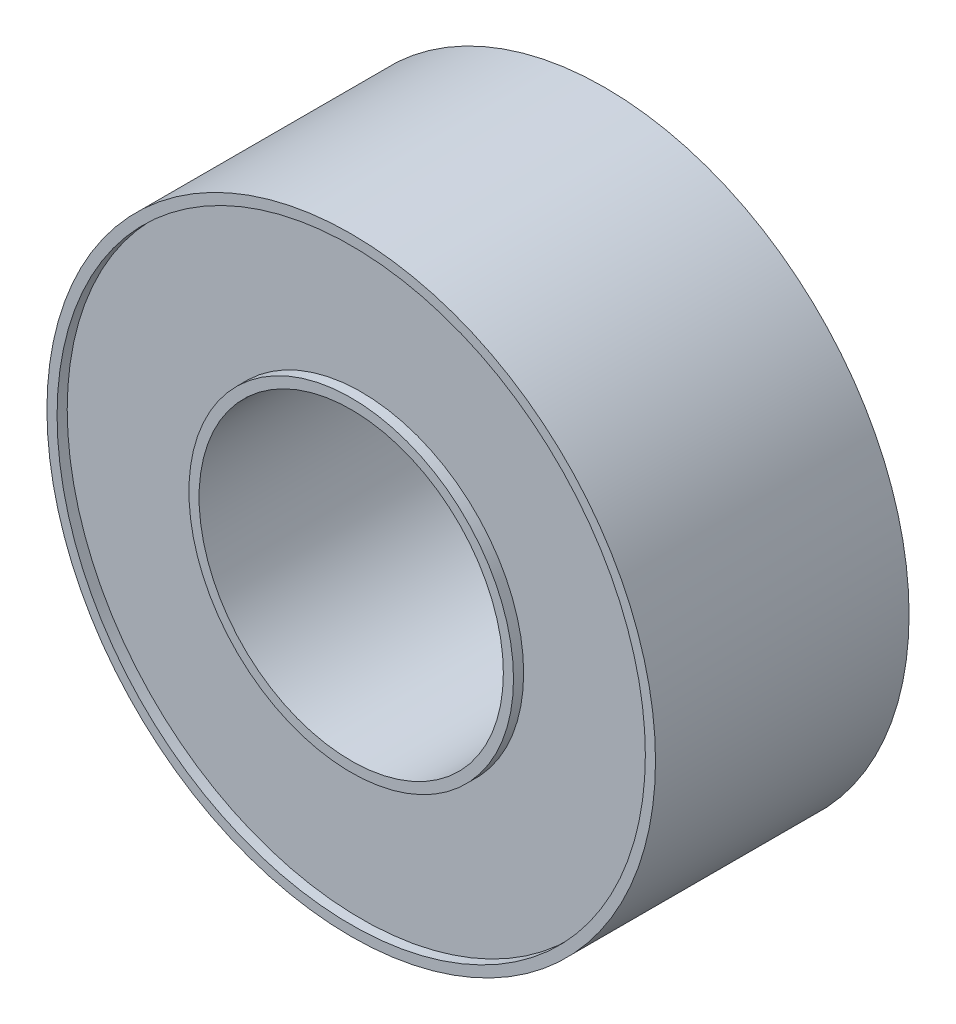
ISO-10303-21;
HEADER;
FILE_DESCRIPTION(('STEP AP214'),'2;1');
FILE_NAME('part.step','',(''),(''),'','','');
FILE_SCHEMA(('AUTOMOTIVE_DESIGN { 1 0 10303 214 1 1 1 1 }'));
ENDSEC;
DATA;
#1=APPLICATION_CONTEXT('core data for automotive mechanical design processes');
#2=APPLICATION_PROTOCOL_DEFINITION('international standard','automotive_design',2000,#1);
#3=PRODUCT_CONTEXT('',#1,'mechanical');
#4=PRODUCT('Part','Part','',(#3));
#5=PRODUCT_RELATED_PRODUCT_CATEGORY('part','',(#4));
#6=PRODUCT_DEFINITION_FORMATION('','',#4);
#7=PRODUCT_DEFINITION_CONTEXT('part definition',#1,'design');
#8=PRODUCT_DEFINITION('design','',#6,#7);
#9=PRODUCT_DEFINITION_SHAPE('','',#8);
#10=(LENGTH_UNIT() NAMED_UNIT(*) SI_UNIT(.MILLI.,.METRE.));
#11=(NAMED_UNIT(*) PLANE_ANGLE_UNIT() SI_UNIT($,.RADIAN.));
#12=(NAMED_UNIT(*) SI_UNIT($,.STERADIAN.) SOLID_ANGLE_UNIT());
#13=UNCERTAINTY_MEASURE_WITH_UNIT(LENGTH_MEASURE(1.E-05),#10,'distance_accuracy_value','');
#14=(GEOMETRIC_REPRESENTATION_CONTEXT(3) GLOBAL_UNCERTAINTY_ASSIGNED_CONTEXT((#13)) GLOBAL_UNIT_ASSIGNED_CONTEXT((#10,
#11,#12)) REPRESENTATION_CONTEXT('',''));
#15=CARTESIAN_POINT('',(0.,0.,0.));
#16=DIRECTION('',(0.,0.,1.));
#17=DIRECTION('',(1.,0.,0.));
#18=AXIS2_PLACEMENT_3D('',#15,#16,#17);
#19=CARTESIAN_POINT('',(0.,0.,0.));
#20=DIRECTION('',(0.,0.,1.));
#21=DIRECTION('',(1.,0.,0.));
#22=AXIS2_PLACEMENT_3D('',#19,#20,#21);
#23=PLANE('',#22);
#24=CARTESIAN_POINT('',(0.,0.,0.));
#25=DIRECTION('',(0.,0.,1.));
#26=DIRECTION('',(1.,0.,0.));
#27=AXIS2_PLACEMENT_3D('',#24,#25,#26);
#28=CIRCLE('',#27,1.5);
#29=CARTESIAN_POINT('',(1.5,0.,0.));
#30=VERTEX_POINT('',#29);
#31=EDGE_CURVE('E54',#30,#30,#28,.T.);
#32=ORIENTED_EDGE('',*,*,#31,.T.);
#33=EDGE_LOOP('',(#32));
#34=FACE_BOUND('',#33,.T.);
#35=CARTESIAN_POINT('',(0.,0.,0.));
#36=DIRECTION('',(0.,0.,-1.));
#37=DIRECTION('',(-1.,0.,0.));
#38=AXIS2_PLACEMENT_3D('',#35,#36,#37);
#39=CIRCLE('',#38,1.6);
#40=CARTESIAN_POINT('',(-1.6,0.,0.));
#41=VERTEX_POINT('',#40);
#42=EDGE_CURVE('E95',#41,#41,#39,.T.);
#43=ORIENTED_EDGE('',*,*,#42,.T.);
#44=EDGE_LOOP('',(#43));
#45=FACE_BOUND('',#44,.T.);
#46=ADVANCED_FACE('F50',(#34,#45),#23,.F.);
#47=CARTESIAN_POINT('',(0.,0.,2.5));
#48=DIRECTION('',(0.,0.,-1.));
#49=DIRECTION('',(-1.,0.,0.));
#50=AXIS2_PLACEMENT_3D('',#47,#48,#49);
#51=CYLINDRICAL_SURFACE('',#50,1.5);
#52=CARTESIAN_POINT('',(0.,0.,2.5));
#53=DIRECTION('',(0.,0.,1.));
#54=DIRECTION('',(1.,0.,0.));
#55=AXIS2_PLACEMENT_3D('',#52,#53,#54);
#56=CIRCLE('',#55,1.5);
#57=CARTESIAN_POINT('',(1.5,0.,2.5));
#58=VERTEX_POINT('',#57);
#59=EDGE_CURVE('E59',#58,#58,#56,.T.);
#60=ORIENTED_EDGE('',*,*,#59,.T.);
#61=EDGE_LOOP('',(#60));
#62=FACE_BOUND('',#61,.T.);
#63=ORIENTED_EDGE('',*,*,#31,.F.);
#64=EDGE_LOOP('',(#63));
#65=FACE_BOUND('',#64,.T.);
#66=ADVANCED_FACE('F52',(#62,#65),#51,.F.);
#67=CARTESIAN_POINT('',(0.,0.,2.5));
#68=DIRECTION('',(0.,0.,-1.));
#69=DIRECTION('',(-1.,0.,0.));
#70=AXIS2_PLACEMENT_3D('',#67,#68,#69);
#71=CYLINDRICAL_SURFACE('',#70,1.6);
#72=CARTESIAN_POINT('',(0.,0.,2.4));
#73=DIRECTION('',(0.,0.,1.));
#74=DIRECTION('',(1.,0.,0.));
#75=AXIS2_PLACEMENT_3D('',#72,#73,#74);
#76=CIRCLE('',#75,1.6);
#77=CARTESIAN_POINT('',(1.6,0.,2.4));
#78=VERTEX_POINT('',#77);
#79=EDGE_CURVE('E66',#78,#78,#76,.T.);
#80=ORIENTED_EDGE('',*,*,#79,.T.);
#81=EDGE_LOOP('',(#80));
#82=FACE_BOUND('',#81,.T.);
#83=CARTESIAN_POINT('',(0.,0.,2.5));
#84=DIRECTION('',(0.,0.,1.));
#85=DIRECTION('',(1.,0.,0.));
#86=AXIS2_PLACEMENT_3D('',#83,#84,#85);
#87=CIRCLE('',#86,1.6);
#88=CARTESIAN_POINT('',(1.6,0.,2.5));
#89=VERTEX_POINT('',#88);
#90=EDGE_CURVE('E11',#89,#89,#87,.T.);
#91=ORIENTED_EDGE('',*,*,#90,.F.);
#92=EDGE_LOOP('',(#91));
#93=FACE_BOUND('',#92,.T.);
#94=ADVANCED_FACE('F146',(#82,#93),#71,.T.);
#95=CARTESIAN_POINT('',(0.,0.,2.5));
#96=DIRECTION('',(0.,0.,1.));
#97=DIRECTION('',(1.,0.,0.));
#98=AXIS2_PLACEMENT_3D('',#95,#96,#97);
#99=PLANE('',#98);
#100=ORIENTED_EDGE('',*,*,#59,.F.);
#101=EDGE_LOOP('',(#100));
#102=FACE_BOUND('',#101,.T.);
#103=ORIENTED_EDGE('',*,*,#90,.T.);
#104=EDGE_LOOP('',(#103));
#105=FACE_BOUND('',#104,.T.);
#106=ADVANCED_FACE('F123',(#102,#105),#99,.T.);
#107=CARTESIAN_POINT('',(0.,0.,0.));
#108=DIRECTION('',(0.,0.,-1.));
#109=DIRECTION('',(-1.,0.,0.));
#110=AXIS2_PLACEMENT_3D('',#107,#108,#109);
#111=CIRCLE('',#110,2.9);
#112=CARTESIAN_POINT('',(-2.9,0.,0.));
#113=VERTEX_POINT('',#112);
#114=EDGE_CURVE('E87',#113,#113,#111,.T.);
#115=ORIENTED_EDGE('',*,*,#114,.F.);
#116=EDGE_LOOP('',(#115));
#117=FACE_BOUND('',#116,.T.);
#118=CARTESIAN_POINT('',(0.,0.,0.));
#119=DIRECTION('',(0.,0.,1.));
#120=DIRECTION('',(1.,0.,0.));
#121=AXIS2_PLACEMENT_3D('',#118,#119,#120);
#122=CIRCLE('',#121,3.);
#123=CARTESIAN_POINT('',(3.,0.,0.));
#124=VERTEX_POINT('',#123);
#125=EDGE_CURVE('E75',#124,#124,#122,.T.);
#126=ORIENTED_EDGE('',*,*,#125,.F.);
#127=EDGE_LOOP('',(#126));
#128=FACE_BOUND('',#127,.T.);
#129=ADVANCED_FACE('F119',(#117,#128),#23,.F.);
#130=CARTESIAN_POINT('',(0.,0.,2.4));
#131=DIRECTION('',(0.,0.,1.));
#132=DIRECTION('',(1.,0.,0.));
#133=AXIS2_PLACEMENT_3D('',#130,#131,#132);
#134=PLANE('',#133);
#135=CARTESIAN_POINT('',(0.,0.,2.4));
#136=DIRECTION('',(0.,0.,1.));
#137=DIRECTION('',(1.,0.,0.));
#138=AXIS2_PLACEMENT_3D('',#135,#136,#137);
#139=CIRCLE('',#138,2.9);
#140=CARTESIAN_POINT('',(2.9,0.,2.4));
#141=VERTEX_POINT('',#140);
#142=EDGE_CURVE('E70',#141,#141,#139,.F.);
#143=ORIENTED_EDGE('',*,*,#142,.F.);
#144=EDGE_LOOP('',(#143));
#145=FACE_BOUND('',#144,.T.);
#146=ORIENTED_EDGE('',*,*,#79,.F.);
#147=EDGE_LOOP('',(#146));
#148=FACE_BOUND('',#147,.T.);
#149=ADVANCED_FACE('F122',(#145,#148),#134,.T.);
#150=CARTESIAN_POINT('',(0.,0.,2.5));
#151=DIRECTION('',(0.,0.,-1.));
#152=DIRECTION('',(-1.,0.,0.));
#153=AXIS2_PLACEMENT_3D('',#150,#151,#152);
#154=CYLINDRICAL_SURFACE('',#153,2.9);
#155=ORIENTED_EDGE('',*,*,#142,.T.);
#156=EDGE_LOOP('',(#155));
#157=FACE_BOUND('',#156,.T.);
#158=CARTESIAN_POINT('',(0.,0.,2.5));
#159=DIRECTION('',(0.,0.,1.));
#160=DIRECTION('',(1.,0.,0.));
#161=AXIS2_PLACEMENT_3D('',#158,#159,#160);
#162=CIRCLE('',#161,2.9);
#163=CARTESIAN_POINT('',(2.9,0.,2.5));
#164=VERTEX_POINT('',#163);
#165=EDGE_CURVE('E79',#164,#164,#162,.T.);
#166=ORIENTED_EDGE('',*,*,#165,.T.);
#167=EDGE_LOOP('',(#166));
#168=FACE_BOUND('',#167,.T.);
#169=ADVANCED_FACE('F129',(#157,#168),#154,.F.);
#170=CARTESIAN_POINT('',(0.,0.,2.5));
#171=DIRECTION('',(0.,0.,-1.));
#172=DIRECTION('',(-1.,0.,0.));
#173=AXIS2_PLACEMENT_3D('',#170,#171,#172);
#174=CYLINDRICAL_SURFACE('',#173,3.);
#175=CARTESIAN_POINT('',(0.,0.,2.5));
#176=DIRECTION('',(0.,0.,1.));
#177=DIRECTION('',(1.,0.,0.));
#178=AXIS2_PLACEMENT_3D('',#175,#176,#177);
#179=CIRCLE('',#178,3.);
#180=CARTESIAN_POINT('',(3.,0.,2.5));
#181=VERTEX_POINT('',#180);
#182=EDGE_CURVE('E74',#181,#181,#179,.T.);
#183=ORIENTED_EDGE('',*,*,#182,.F.);
#184=EDGE_LOOP('',(#183));
#185=FACE_BOUND('',#184,.T.);
#186=ORIENTED_EDGE('',*,*,#125,.T.);
#187=EDGE_LOOP('',(#186));
#188=FACE_BOUND('',#187,.T.);
#189=ADVANCED_FACE('F127',(#185,#188),#174,.T.);
#190=CARTESIAN_POINT('',(0.,0.,2.5));
#191=DIRECTION('',(0.,0.,1.));
#192=DIRECTION('',(1.,0.,0.));
#193=AXIS2_PLACEMENT_3D('',#190,#191,#192);
#194=PLANE('',#193);
#195=ORIENTED_EDGE('',*,*,#165,.F.);
#196=EDGE_LOOP('',(#195));
#197=FACE_BOUND('',#196,.T.);
#198=ORIENTED_EDGE('',*,*,#182,.T.);
#199=EDGE_LOOP('',(#198));
#200=FACE_BOUND('',#199,.T.);
#201=ADVANCED_FACE('F115',(#197,#200),#194,.T.);
#202=CARTESIAN_POINT('',(0.,0.,0.1));
#203=DIRECTION('',(0.,0.,-1.));
#204=DIRECTION('',(-1.,0.,0.));
#205=AXIS2_PLACEMENT_3D('',#202,#203,#204);
#206=CYLINDRICAL_SURFACE('',#205,2.9);
#207=CARTESIAN_POINT('',(0.,0.,0.1));
#208=DIRECTION('',(0.,0.,-1.));
#209=DIRECTION('',(-1.,0.,0.));
#210=AXIS2_PLACEMENT_3D('',#207,#208,#209);
#211=CIRCLE('',#210,2.9);
#212=CARTESIAN_POINT('',(-2.9,0.,0.1));
#213=VERTEX_POINT('',#212);
#214=EDGE_CURVE('E80',#213,#213,#211,.T.);
#215=ORIENTED_EDGE('',*,*,#214,.F.);
#216=EDGE_LOOP('',(#215));
#217=FACE_BOUND('',#216,.T.);
#218=ORIENTED_EDGE('',*,*,#114,.T.);
#219=EDGE_LOOP('',(#218));
#220=FACE_BOUND('',#219,.T.);
#221=ADVANCED_FACE('F109',(#217,#220),#206,.F.);
#222=CARTESIAN_POINT('',(0.,0.,0.1));
#223=DIRECTION('',(0.,0.,-1.));
#224=DIRECTION('',(-1.,0.,0.));
#225=AXIS2_PLACEMENT_3D('',#222,#223,#224);
#226=PLANE('',#225);
#227=CARTESIAN_POINT('',(0.,0.,0.1));
#228=DIRECTION('',(0.,0.,-1.));
#229=DIRECTION('',(-1.,0.,0.));
#230=AXIS2_PLACEMENT_3D('',#227,#228,#229);
#231=CIRCLE('',#230,1.6);
#232=CARTESIAN_POINT('',(-1.6,0.,0.1));
#233=VERTEX_POINT('',#232);
#234=EDGE_CURVE('E91',#233,#233,#231,.T.);
#235=ORIENTED_EDGE('',*,*,#234,.F.);
#236=EDGE_LOOP('',(#235));
#237=FACE_BOUND('',#236,.T.);
#238=ORIENTED_EDGE('',*,*,#214,.T.);
#239=EDGE_LOOP('',(#238));
#240=FACE_BOUND('',#239,.T.);
#241=ADVANCED_FACE('F106',(#237,#240),#226,.T.);
#242=CARTESIAN_POINT('',(0.,0.,0.1));
#243=DIRECTION('',(0.,0.,-1.));
#244=DIRECTION('',(-1.,0.,0.));
#245=AXIS2_PLACEMENT_3D('',#242,#243,#244);
#246=CYLINDRICAL_SURFACE('',#245,1.6);
#247=ORIENTED_EDGE('',*,*,#234,.T.);
#248=EDGE_LOOP('',(#247));
#249=FACE_BOUND('',#248,.T.);
#250=ORIENTED_EDGE('',*,*,#42,.F.);
#251=EDGE_LOOP('',(#250));
#252=FACE_BOUND('',#251,.T.);
#253=ADVANCED_FACE('F103',(#249,#252),#246,.T.);
#254=CLOSED_SHELL('',(#46,#66,#94,#106,#129,#149,#169,#189,#201,#221,#241,#253));
#255=MANIFOLD_SOLID_BREP('B2',#254);
#256=ADVANCED_BREP_SHAPE_REPRESENTATION('',(#18,#255),#14);
#257=SHAPE_DEFINITION_REPRESENTATION(#9,#256);
ENDSEC;
END-ISO-10303-21;
